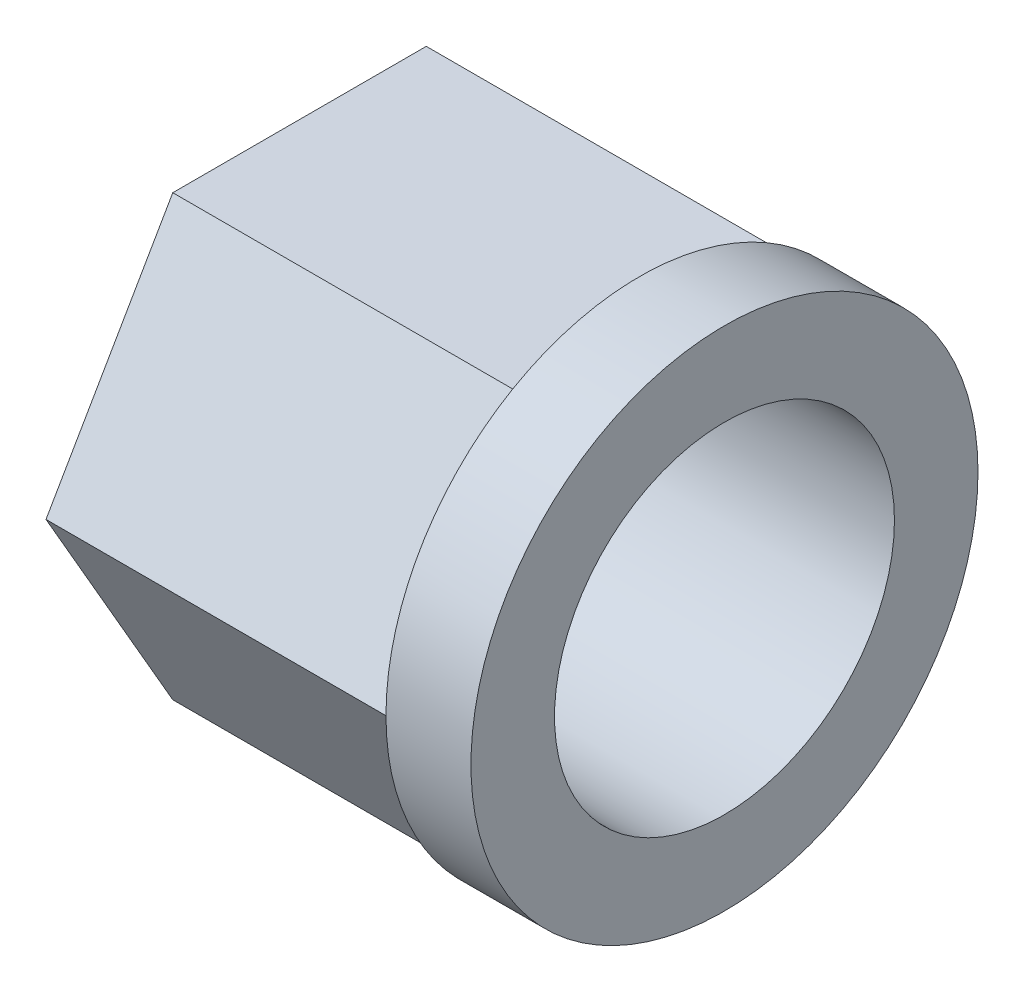
ISO-10303-21;
HEADER;
FILE_DESCRIPTION(('STEP AP214'),'2;1');
FILE_NAME('part.step','',(''),(''),'','','');
FILE_SCHEMA(('AUTOMOTIVE_DESIGN { 1 0 10303 214 1 1 1 1 }'));
ENDSEC;
DATA;
#1=APPLICATION_CONTEXT('core data for automotive mechanical design processes');
#2=APPLICATION_PROTOCOL_DEFINITION('international standard','automotive_design',2000,#1);
#3=PRODUCT_CONTEXT('',#1,'mechanical');
#4=PRODUCT('Part','Part','',(#3));
#5=PRODUCT_RELATED_PRODUCT_CATEGORY('part','',(#4));
#6=PRODUCT_DEFINITION_FORMATION('','',#4);
#7=PRODUCT_DEFINITION_CONTEXT('part definition',#1,'design');
#8=PRODUCT_DEFINITION('design','',#6,#7);
#9=PRODUCT_DEFINITION_SHAPE('','',#8);
#10=(LENGTH_UNIT() NAMED_UNIT(*) SI_UNIT(.MILLI.,.METRE.));
#11=(NAMED_UNIT(*) PLANE_ANGLE_UNIT() SI_UNIT($,.RADIAN.));
#12=(NAMED_UNIT(*) SI_UNIT($,.STERADIAN.) SOLID_ANGLE_UNIT());
#13=UNCERTAINTY_MEASURE_WITH_UNIT(LENGTH_MEASURE(1.E-05),#10,'distance_accuracy_value','');
#14=(GEOMETRIC_REPRESENTATION_CONTEXT(3) GLOBAL_UNCERTAINTY_ASSIGNED_CONTEXT((#13)) GLOBAL_UNIT_ASSIGNED_CONTEXT((#10,
#11,#12)) REPRESENTATION_CONTEXT('',''));
#15=CARTESIAN_POINT('',(0.,0.,0.));
#16=DIRECTION('',(0.,0.,1.));
#17=DIRECTION('',(1.,0.,0.));
#18=AXIS2_PLACEMENT_3D('',#15,#16,#17);
#19=CARTESIAN_POINT('',(-8.,0.,0.));
#20=DIRECTION('',(1.,0.,0.));
#21=DIRECTION('',(0.,0.,-1.));
#22=AXIS2_PLACEMENT_3D('',#19,#20,#21);
#23=CYLINDRICAL_SURFACE('',#22,3.175);
#24=CARTESIAN_POINT('',(0.,0.,0.));
#25=DIRECTION('',(1.,0.,0.));
#26=DIRECTION('',(0.,0.,-1.));
#27=AXIS2_PLACEMENT_3D('',#24,#25,#26);
#28=CIRCLE('',#27,3.175);
#29=CARTESIAN_POINT('',(0.,0.,-3.175));
#30=VERTEX_POINT('',#29);
#31=EDGE_CURVE('E175',#30,#30,#28,.T.);
#32=ORIENTED_EDGE('',*,*,#31,.F.);
#33=EDGE_LOOP('',(#32));
#34=FACE_BOUND('',#33,.T.);
#35=CARTESIAN_POINT('',(2.,0.,0.));
#36=DIRECTION('',(1.,0.,0.));
#37=DIRECTION('',(0.,0.,-1.));
#38=AXIS2_PLACEMENT_3D('',#35,#36,#37);
#39=CIRCLE('',#38,3.175);
#40=CARTESIAN_POINT('',(2.,0.,-3.175));
#41=VERTEX_POINT('',#40);
#42=EDGE_CURVE('E39',#41,#41,#39,.F.);
#43=ORIENTED_EDGE('',*,*,#42,.F.);
#44=EDGE_LOOP('',(#43));
#45=FACE_BOUND('',#44,.T.);
#46=ADVANCED_FACE('F35',(#34,#45),#23,.F.);
#47=CARTESIAN_POINT('',(12.,-7.75,-4.4744645862196));
#48=DIRECTION('',(0.,0.499999999999999,0.866025403784439));
#49=DIRECTION('',(0.,-0.866025403784439,0.499999999999999));
#50=AXIS2_PLACEMENT_3D('',#47,#48,#49);
#51=PLANE('',#50);
#52=DIRECTION('',(0.,0.866025403784439,-0.499999999999999));
#53=VECTOR('',#52,1.);
#54=CARTESIAN_POINT('',(0.,-7.75,-4.4744645862196));
#55=LINE('',#54,#53);
#56=CARTESIAN_POINT('',(0.,-7.75,-4.4744645862196));
#57=VERTEX_POINT('',#56);
#58=CARTESIAN_POINT('',(0.,0.,-8.9489291724392));
#59=VERTEX_POINT('',#58);
#60=EDGE_CURVE('E150',#57,#59,#55,.T.);
#61=ORIENTED_EDGE('',*,*,#60,.T.);
#62=DIRECTION('',(-1.,0.,0.));
#63=VECTOR('',#62,1.);
#64=CARTESIAN_POINT('',(12.,0.,-8.9489291724392));
#65=LINE('',#64,#63);
#66=CARTESIAN_POINT('',(12.,0.,-8.9489291724392));
#67=VERTEX_POINT('',#66);
#68=EDGE_CURVE('E11',#67,#59,#65,.T.);
#69=ORIENTED_EDGE('',*,*,#68,.F.);
#70=DIRECTION('',(0.,0.866025403784439,-0.499999999999999));
#71=VECTOR('',#70,1.);
#72=CARTESIAN_POINT('',(12.,-7.75,-4.4744645862196));
#73=LINE('',#72,#71);
#74=CARTESIAN_POINT('',(12.,-7.75,-4.4744645862196));
#75=VERTEX_POINT('',#74);
#76=EDGE_CURVE('E140',#75,#67,#73,.T.);
#77=ORIENTED_EDGE('',*,*,#76,.F.);
#78=DIRECTION('',(-1.,0.,0.));
#79=VECTOR('',#78,1.);
#80=CARTESIAN_POINT('',(12.,-7.75,-4.4744645862196));
#81=LINE('',#80,#79);
#82=EDGE_CURVE('E149',#75,#57,#81,.T.);
#83=ORIENTED_EDGE('',*,*,#82,.T.);
#84=EDGE_LOOP('',(#61,#69,#77,#83));
#85=FACE_BOUND('',#84,.T.);
#86=ADVANCED_FACE('F37',(#85),#51,.F.);
#87=CARTESIAN_POINT('',(12.,0.,-8.9489291724392));
#88=DIRECTION('',(0.,-0.5,0.866025403784439));
#89=DIRECTION('',(0.,-0.866025403784439,-0.5));
#90=AXIS2_PLACEMENT_3D('',#87,#88,#89);
#91=PLANE('',#90);
#92=DIRECTION('',(0.,0.866025403784439,0.5));
#93=VECTOR('',#92,1.);
#94=CARTESIAN_POINT('',(0.,0.,-8.9489291724392));
#95=LINE('',#94,#93);
#96=CARTESIAN_POINT('',(0.,7.75,-4.4744645862196));
#97=VERTEX_POINT('',#96);
#98=EDGE_CURVE('E153',#59,#97,#95,.T.);
#99=ORIENTED_EDGE('',*,*,#98,.T.);
#100=DIRECTION('',(-1.,0.,0.));
#101=VECTOR('',#100,1.);
#102=CARTESIAN_POINT('',(12.,7.75,-4.4744645862196));
#103=LINE('',#102,#101);
#104=CARTESIAN_POINT('',(12.,7.75,-4.4744645862196));
#105=VERTEX_POINT('',#104);
#106=EDGE_CURVE('E45',#105,#97,#103,.T.);
#107=ORIENTED_EDGE('',*,*,#106,.F.);
#108=DIRECTION('',(0.,0.866025403784439,0.5));
#109=VECTOR('',#108,1.);
#110=CARTESIAN_POINT('',(12.,0.,-8.9489291724392));
#111=LINE('',#110,#109);
#112=EDGE_CURVE('E89',#67,#105,#111,.T.);
#113=ORIENTED_EDGE('',*,*,#112,.F.);
#114=ORIENTED_EDGE('',*,*,#68,.T.);
#115=EDGE_LOOP('',(#99,#107,#113,#114));
#116=FACE_BOUND('',#115,.T.);
#117=ADVANCED_FACE('F217',(#116),#91,.F.);
#118=CARTESIAN_POINT('',(12.,7.75,-4.4744645862196));
#119=DIRECTION('',(0.,-1.,0.));
#120=DIRECTION('',(0.,0.,-1.));
#121=AXIS2_PLACEMENT_3D('',#118,#119,#120);
#122=PLANE('',#121);
#123=DIRECTION('',(0.,0.,1.));
#124=VECTOR('',#123,1.);
#125=CARTESIAN_POINT('',(0.,7.75,-4.4744645862196));
#126=LINE('',#125,#124);
#127=CARTESIAN_POINT('',(0.,7.75,4.4744645862196));
#128=VERTEX_POINT('',#127);
#129=EDGE_CURVE('E104',#97,#128,#126,.T.);
#130=ORIENTED_EDGE('',*,*,#129,.T.);
#131=DIRECTION('',(-1.,0.,0.));
#132=VECTOR('',#131,1.);
#133=CARTESIAN_POINT('',(12.,7.75,4.4744645862196));
#134=LINE('',#133,#132);
#135=CARTESIAN_POINT('',(12.,7.75,4.4744645862196));
#136=VERTEX_POINT('',#135);
#137=EDGE_CURVE('E97',#136,#128,#134,.T.);
#138=ORIENTED_EDGE('',*,*,#137,.F.);
#139=DIRECTION('',(0.,0.,1.));
#140=VECTOR('',#139,1.);
#141=CARTESIAN_POINT('',(12.,7.75,-4.4744645862196));
#142=LINE('',#141,#140);
#143=EDGE_CURVE('E102',#105,#136,#142,.T.);
#144=ORIENTED_EDGE('',*,*,#143,.F.);
#145=ORIENTED_EDGE('',*,*,#106,.T.);
#146=EDGE_LOOP('',(#130,#138,#144,#145));
#147=FACE_BOUND('',#146,.T.);
#148=ADVANCED_FACE('F99',(#147),#122,.F.);
#149=CARTESIAN_POINT('',(12.,7.75,4.4744645862196));
#150=DIRECTION('',(0.,-0.5,-0.866025403784439));
#151=DIRECTION('',(0.,0.866025403784439,-0.5));
#152=AXIS2_PLACEMENT_3D('',#149,#150,#151);
#153=PLANE('',#152);
#154=DIRECTION('',(0.,-0.866025403784439,0.5));
#155=VECTOR('',#154,1.);
#156=CARTESIAN_POINT('',(0.,7.75,4.4744645862196));
#157=LINE('',#156,#155);
#158=CARTESIAN_POINT('',(0.,0.,8.9489291724392));
#159=VERTEX_POINT('',#158);
#160=EDGE_CURVE('E156',#128,#159,#157,.T.);
#161=ORIENTED_EDGE('',*,*,#160,.T.);
#162=DIRECTION('',(-1.,0.,0.));
#163=VECTOR('',#162,1.);
#164=CARTESIAN_POINT('',(12.,0.,8.9489291724392));
#165=LINE('',#164,#163);
#166=CARTESIAN_POINT('',(12.,0.,8.9489291724392));
#167=VERTEX_POINT('',#166);
#168=EDGE_CURVE('E107',#167,#159,#165,.T.);
#169=ORIENTED_EDGE('',*,*,#168,.F.);
#170=DIRECTION('',(0.,-0.866025403784439,0.5));
#171=VECTOR('',#170,1.);
#172=CARTESIAN_POINT('',(12.,7.75,4.4744645862196));
#173=LINE('',#172,#171);
#174=EDGE_CURVE('E110',#136,#167,#173,.T.);
#175=ORIENTED_EDGE('',*,*,#174,.F.);
#176=ORIENTED_EDGE('',*,*,#137,.T.);
#177=EDGE_LOOP('',(#161,#169,#175,#176));
#178=FACE_BOUND('',#177,.T.);
#179=ADVANCED_FACE('F111',(#178),#153,.F.);
#180=CARTESIAN_POINT('',(12.,0.,8.9489291724392));
#181=DIRECTION('',(0.,0.5,-0.866025403784439));
#182=DIRECTION('',(0.,0.866025403784439,0.5));
#183=AXIS2_PLACEMENT_3D('',#180,#181,#182);
#184=PLANE('',#183);
#185=DIRECTION('',(0.,-0.866025403784438,-0.5));
#186=VECTOR('',#185,1.);
#187=CARTESIAN_POINT('',(0.,0.,8.9489291724392));
#188=LINE('',#187,#186);
#189=CARTESIAN_POINT('',(0.,-7.75,4.4744645862196));
#190=VERTEX_POINT('',#189);
#191=EDGE_CURVE('E75',#159,#190,#188,.T.);
#192=ORIENTED_EDGE('',*,*,#191,.T.);
#193=DIRECTION('',(-1.,0.,0.));
#194=VECTOR('',#193,1.);
#195=CARTESIAN_POINT('',(12.,-7.75,4.4744645862196));
#196=LINE('',#195,#194);
#197=CARTESIAN_POINT('',(12.,-7.75,4.4744645862196));
#198=VERTEX_POINT('',#197);
#199=EDGE_CURVE('E53',#198,#190,#196,.T.);
#200=ORIENTED_EDGE('',*,*,#199,.F.);
#201=DIRECTION('',(0.,-0.866025403784438,-0.5));
#202=VECTOR('',#201,1.);
#203=CARTESIAN_POINT('',(12.,0.,8.9489291724392));
#204=LINE('',#203,#202);
#205=EDGE_CURVE('E115',#167,#198,#204,.T.);
#206=ORIENTED_EDGE('',*,*,#205,.F.);
#207=ORIENTED_EDGE('',*,*,#168,.T.);
#208=EDGE_LOOP('',(#192,#200,#206,#207));
#209=FACE_BOUND('',#208,.T.);
#210=ADVANCED_FACE('F166',(#209),#184,.F.);
#211=CARTESIAN_POINT('',(12.,-7.75,4.4744645862196));
#212=DIRECTION('',(0.,1.,0.));
#213=DIRECTION('',(0.,0.,1.));
#214=AXIS2_PLACEMENT_3D('',#211,#212,#213);
#215=PLANE('',#214);
#216=DIRECTION('',(0.,0.,-1.));
#217=VECTOR('',#216,1.);
#218=CARTESIAN_POINT('',(0.,-7.75,4.4744645862196));
#219=LINE('',#218,#217);
#220=EDGE_CURVE('E81',#190,#57,#219,.T.);
#221=ORIENTED_EDGE('',*,*,#220,.T.);
#222=ORIENTED_EDGE('',*,*,#82,.F.);
#223=DIRECTION('',(0.,0.,-1.));
#224=VECTOR('',#223,1.);
#225=CARTESIAN_POINT('',(12.,-7.75,4.4744645862196));
#226=LINE('',#225,#224);
#227=EDGE_CURVE('E146',#198,#75,#226,.T.);
#228=ORIENTED_EDGE('',*,*,#227,.F.);
#229=ORIENTED_EDGE('',*,*,#199,.T.);
#230=EDGE_LOOP('',(#221,#222,#228,#229));
#231=FACE_BOUND('',#230,.T.);
#232=ADVANCED_FACE('F234',(#231),#215,.F.);
#233=CARTESIAN_POINT('',(0.,0.,0.));
#234=DIRECTION('',(1.,0.,0.));
#235=DIRECTION('',(0.,0.,-1.));
#236=AXIS2_PLACEMENT_3D('',#233,#234,#235);
#237=PLANE('',#236);
#238=ORIENTED_EDGE('',*,*,#31,.T.);
#239=EDGE_LOOP('',(#238));
#240=FACE_BOUND('',#239,.T.);
#241=ORIENTED_EDGE('',*,*,#60,.F.);
#242=ORIENTED_EDGE('',*,*,#220,.F.);
#243=ORIENTED_EDGE('',*,*,#191,.F.);
#244=ORIENTED_EDGE('',*,*,#160,.F.);
#245=ORIENTED_EDGE('',*,*,#129,.F.);
#246=ORIENTED_EDGE('',*,*,#98,.F.);
#247=EDGE_LOOP('',(#241,#242,#243,#244,#245,#246));
#248=FACE_BOUND('',#247,.T.);
#249=ADVANCED_FACE('F165',(#240,#248),#237,.F.);
#250=CARTESIAN_POINT('',(12.,0.,0.));
#251=DIRECTION('',(1.,0.,0.));
#252=DIRECTION('',(0.,0.,-1.));
#253=AXIS2_PLACEMENT_3D('',#250,#251,#252);
#254=PLANE('',#253);
#255=CARTESIAN_POINT('',(12.,0.,0.));
#256=DIRECTION('',(1.,0.,0.));
#257=DIRECTION('',(0.,0.,-1.));
#258=AXIS2_PLACEMENT_3D('',#255,#256,#257);
#259=CIRCLE('',#258,8.9489291724392);
#260=EDGE_CURVE('E136',#75,#67,#259,.T.);
#261=ORIENTED_EDGE('',*,*,#260,.F.);
#262=ORIENTED_EDGE('',*,*,#76,.T.);
#263=EDGE_LOOP('',(#261,#262));
#264=FACE_BOUND('',#263,.T.);
#265=ADVANCED_FACE('F222',(#264),#254,.F.);
#266=EDGE_CURVE('E134',#67,#105,#259,.T.);
#267=ORIENTED_EDGE('',*,*,#266,.F.);
#268=ORIENTED_EDGE('',*,*,#112,.T.);
#269=EDGE_LOOP('',(#267,#268));
#270=FACE_BOUND('',#269,.T.);
#271=ADVANCED_FACE('F227',(#270),#254,.F.);
#272=EDGE_CURVE('E121',#105,#136,#259,.T.);
#273=ORIENTED_EDGE('',*,*,#272,.F.);
#274=ORIENTED_EDGE('',*,*,#143,.T.);
#275=EDGE_LOOP('',(#273,#274));
#276=FACE_BOUND('',#275,.T.);
#277=ADVANCED_FACE('F119',(#276),#254,.F.);
#278=EDGE_CURVE('E125',#136,#167,#259,.T.);
#279=ORIENTED_EDGE('',*,*,#278,.F.);
#280=ORIENTED_EDGE('',*,*,#174,.T.);
#281=EDGE_LOOP('',(#279,#280));
#282=FACE_BOUND('',#281,.T.);
#283=ADVANCED_FACE('F126',(#282),#254,.F.);
#284=EDGE_CURVE('E129',#167,#198,#259,.T.);
#285=ORIENTED_EDGE('',*,*,#284,.F.);
#286=ORIENTED_EDGE('',*,*,#205,.T.);
#287=EDGE_LOOP('',(#285,#286));
#288=FACE_BOUND('',#287,.T.);
#289=ADVANCED_FACE('F169',(#288),#254,.F.);
#290=CARTESIAN_POINT('',(15.,0.,0.));
#291=DIRECTION('',(-1.,0.,0.));
#292=DIRECTION('',(0.,0.,1.));
#293=AXIS2_PLACEMENT_3D('',#290,#291,#292);
#294=CYLINDRICAL_SURFACE('',#293,8.9489291724392);
#295=CARTESIAN_POINT('',(15.,0.,0.));
#296=DIRECTION('',(1.,0.,0.));
#297=DIRECTION('',(0.,0.,-1.));
#298=AXIS2_PLACEMENT_3D('',#295,#296,#297);
#299=CIRCLE('',#298,8.9489291724392);
#300=CARTESIAN_POINT('',(15.,0.,-8.9489291724392));
#301=VERTEX_POINT('',#300);
#302=EDGE_CURVE('E135',#301,#301,#299,.T.);
#303=ORIENTED_EDGE('',*,*,#302,.F.);
#304=EDGE_LOOP('',(#303));
#305=FACE_BOUND('',#304,.T.);
#306=ORIENTED_EDGE('',*,*,#266,.T.);
#307=ORIENTED_EDGE('',*,*,#272,.T.);
#308=ORIENTED_EDGE('',*,*,#278,.T.);
#309=ORIENTED_EDGE('',*,*,#284,.T.);
#310=EDGE_CURVE('E172',#198,#75,#259,.T.);
#311=ORIENTED_EDGE('',*,*,#310,.T.);
#312=ORIENTED_EDGE('',*,*,#260,.T.);
#313=EDGE_LOOP('',(#306,#307,#308,#309,#311,#312));
#314=FACE_BOUND('',#313,.T.);
#315=ADVANCED_FACE('F131',(#305,#314),#294,.T.);
#316=CARTESIAN_POINT('',(15.,0.,0.));
#317=DIRECTION('',(1.,0.,0.));
#318=DIRECTION('',(0.,0.,-1.));
#319=AXIS2_PLACEMENT_3D('',#316,#317,#318);
#320=PLANE('',#319);
#321=CARTESIAN_POINT('',(15.,0.,0.));
#322=DIRECTION('',(1.,0.,0.));
#323=DIRECTION('',(0.,0.,-1.));
#324=AXIS2_PLACEMENT_3D('',#321,#322,#323);
#325=CIRCLE('',#324,6.);
#326=CARTESIAN_POINT('',(15.,0.,-6.));
#327=VERTEX_POINT('',#326);
#328=EDGE_CURVE('E182',#327,#327,#325,.T.);
#329=ORIENTED_EDGE('',*,*,#328,.F.);
#330=EDGE_LOOP('',(#329));
#331=FACE_BOUND('',#330,.T.);
#332=ORIENTED_EDGE('',*,*,#302,.T.);
#333=EDGE_LOOP('',(#332));
#334=FACE_BOUND('',#333,.T.);
#335=ADVANCED_FACE('F197',(#331,#334),#320,.T.);
#336=ORIENTED_EDGE('',*,*,#310,.F.);
#337=ORIENTED_EDGE('',*,*,#227,.T.);
#338=EDGE_LOOP('',(#336,#337));
#339=FACE_BOUND('',#338,.T.);
#340=ADVANCED_FACE('F173',(#339),#254,.F.);
#341=CARTESIAN_POINT('',(2.,0.,0.));
#342=DIRECTION('',(1.,0.,0.));
#343=DIRECTION('',(0.,0.,-1.));
#344=AXIS2_PLACEMENT_3D('',#341,#342,#343);
#345=PLANE('',#344);
#346=CARTESIAN_POINT('',(2.,0.,0.));
#347=DIRECTION('',(1.,0.,0.));
#348=DIRECTION('',(0.,0.,-1.));
#349=AXIS2_PLACEMENT_3D('',#346,#347,#348);
#350=CIRCLE('',#349,6.);
#351=CARTESIAN_POINT('',(2.,0.,-6.));
#352=VERTEX_POINT('',#351);
#353=EDGE_CURVE('E180',#352,#352,#350,.T.);
#354=ORIENTED_EDGE('',*,*,#353,.T.);
#355=EDGE_LOOP('',(#354));
#356=FACE_BOUND('',#355,.T.);
#357=ORIENTED_EDGE('',*,*,#42,.T.);
#358=EDGE_LOOP('',(#357));
#359=FACE_BOUND('',#358,.T.);
#360=ADVANCED_FACE('F188',(#356,#359),#345,.T.);
#361=CARTESIAN_POINT('',(2.,0.,0.));
#362=DIRECTION('',(1.,0.,0.));
#363=DIRECTION('',(0.,0.,-1.));
#364=AXIS2_PLACEMENT_3D('',#361,#362,#363);
#365=CYLINDRICAL_SURFACE('',#364,6.);
#366=CARTESIAN_POINT('',(2.,0.,-6.));
#367=CARTESIAN_POINT('',(2.13541666666667,0.,-6.));
#368=CARTESIAN_POINT('',(2.27083333333333,0.,-6.));
#369=CARTESIAN_POINT('',(2.54166666666667,0.,-6.));
#370=CARTESIAN_POINT('',(2.67708333333333,0.,-6.));
#371=CARTESIAN_POINT('',(2.94791666666667,0.,-6.));
#372=CARTESIAN_POINT('',(3.08333333333333,0.,-6.));
#373=CARTESIAN_POINT('',(3.35416666666667,0.,-6.));
#374=CARTESIAN_POINT('',(3.48958333333333,0.,-6.));
#375=CARTESIAN_POINT('',(3.76041666666667,0.,-6.));
#376=CARTESIAN_POINT('',(3.89583333333333,0.,-6.));
#377=CARTESIAN_POINT('',(4.16666666666667,0.,-6.));
#378=CARTESIAN_POINT('',(4.30208333333333,0.,-6.));
#379=CARTESIAN_POINT('',(4.57291666666667,0.,-6.));
#380=CARTESIAN_POINT('',(4.70833333333333,0.,-6.));
#381=CARTESIAN_POINT('',(4.97916666666667,0.,-6.));
#382=CARTESIAN_POINT('',(5.11458333333333,0.,-6.));
#383=CARTESIAN_POINT('',(5.38541666666667,0.,-6.));
#384=CARTESIAN_POINT('',(5.52083333333333,0.,-6.));
#385=CARTESIAN_POINT('',(5.79166666666667,0.,-6.));
#386=CARTESIAN_POINT('',(5.92708333333333,0.,-6.));
#387=CARTESIAN_POINT('',(6.19791666666667,0.,-6.));
#388=CARTESIAN_POINT('',(6.33333333333333,0.,-6.));
#389=CARTESIAN_POINT('',(6.60416666666667,0.,-6.));
#390=CARTESIAN_POINT('',(6.73958333333333,0.,-6.));
#391=CARTESIAN_POINT('',(7.01041666666667,0.,-6.));
#392=CARTESIAN_POINT('',(7.14583333333333,0.,-6.));
#393=CARTESIAN_POINT('',(7.41666666666667,0.,-6.));
#394=CARTESIAN_POINT('',(7.55208333333333,0.,-6.));
#395=CARTESIAN_POINT('',(7.82291666666667,0.,-6.));
#396=CARTESIAN_POINT('',(7.95833333333333,0.,-6.));
#397=CARTESIAN_POINT('',(8.22916666666667,0.,-6.));
#398=CARTESIAN_POINT('',(8.36458333333333,0.,-6.));
#399=CARTESIAN_POINT('',(8.63541666666667,0.,-6.));
#400=CARTESIAN_POINT('',(8.77083333333333,0.,-6.));
#401=CARTESIAN_POINT('',(9.04166666666667,0.,-6.));
#402=CARTESIAN_POINT('',(9.17708333333333,0.,-6.));
#403=CARTESIAN_POINT('',(9.44791666666667,0.,-6.));
#404=CARTESIAN_POINT('',(9.58333333333333,0.,-6.));
#405=CARTESIAN_POINT('',(9.85416666666667,0.,-6.));
#406=CARTESIAN_POINT('',(9.98958333333333,0.,-6.));
#407=CARTESIAN_POINT('',(10.2604166666667,0.,-6.));
#408=CARTESIAN_POINT('',(10.3958333333333,0.,-6.));
#409=CARTESIAN_POINT('',(10.6666666666667,0.,-6.));
#410=CARTESIAN_POINT('',(10.8020833333333,0.,-6.));
#411=CARTESIAN_POINT('',(11.0729166666667,0.,-6.));
#412=CARTESIAN_POINT('',(11.2083333333333,0.,-6.));
#413=CARTESIAN_POINT('',(11.4791666666667,0.,-6.));
#414=CARTESIAN_POINT('',(11.6145833333333,0.,-6.));
#415=CARTESIAN_POINT('',(11.8854166666667,0.,-6.));
#416=CARTESIAN_POINT('',(12.0208333333333,0.,-6.));
#417=CARTESIAN_POINT('',(12.2916666666667,0.,-6.));
#418=CARTESIAN_POINT('',(12.4270833333333,0.,-6.));
#419=CARTESIAN_POINT('',(12.6979166666667,0.,-6.));
#420=CARTESIAN_POINT('',(12.8333333333333,0.,-6.));
#421=CARTESIAN_POINT('',(13.1041666666667,0.,-6.));
#422=CARTESIAN_POINT('',(13.2395833333333,0.,-6.));
#423=CARTESIAN_POINT('',(13.5104166666667,0.,-6.));
#424=CARTESIAN_POINT('',(13.6458333333333,0.,-6.));
#425=CARTESIAN_POINT('',(13.9166666666667,0.,-6.));
#426=CARTESIAN_POINT('',(14.0520833333333,0.,-6.));
#427=CARTESIAN_POINT('',(14.3229166666667,0.,-6.));
#428=CARTESIAN_POINT('',(14.4583333333333,0.,-6.));
#429=CARTESIAN_POINT('',(14.7291666666667,0.,-6.));
#430=CARTESIAN_POINT('',(14.8645833333333,0.,-6.));
#431=CARTESIAN_POINT('',(15.,0.,-6.));
#432=B_SPLINE_CURVE_WITH_KNOTS('',3,(#366,#367,#368,#369,#370,#371,#372,#373,#374,#375,#376,
#377,#378,#379,#380,#381,#382,#383,#384,#385,#386,#387,#388,#389,#390,#391,#392,#393,#394,#395,
#396,#397,#398,#399,#400,#401,#402,#403,#404,#405,#406,#407,#408,#409,#410,#411,#412,#413,#414,
#415,#416,#417,#418,#419,#420,#421,#422,#423,#424,#425,#426,#427,#428,#429,#430,#431),
.UNSPECIFIED.,.F.,.F.,(4,2,2,2,2,2,2,2,2,2,2,2,2,2,2,2,2,2,2,2,2,2,2,2,2,2,2,2,2,2,2,2,4),(0.,
0.40625,0.8125,1.21875,1.625,2.03125,2.4375,2.84375,3.25,3.65625,4.0625,4.46875,4.875,5.28125,
5.6875,6.09375,6.5,6.90625,7.3125,7.71875,8.125,8.53125,8.9375,9.34375,9.75,10.15625,10.5625,
10.96875,11.375,11.78125,12.1875,12.59375,13.),.UNSPECIFIED.);
#433=EDGE_CURVE('BSEAM191',#352,#327,#432,.T.);
#434=ORIENTED_EDGE('',*,*,#353,.F.);
#435=ORIENTED_EDGE('',*,*,#328,.T.);
#436=ORIENTED_EDGE('',*,*,#433,.T.);
#437=ORIENTED_EDGE('',*,*,#433,.F.);
#438=EDGE_LOOP('',(#434,#436,#435,#437));
#439=FACE_BOUND('',#438,.T.);
#440=ADVANCED_FACE('F191',(#439),#365,.F.);
#441=CLOSED_SHELL('',(#46,#86,#117,#148,#179,#210,#232,#249,#265,#271,#277,#283,#289,#315,#335,
#340,#360,#440));
#442=MANIFOLD_SOLID_BREP('B2',#441);
#443=ADVANCED_BREP_SHAPE_REPRESENTATION('',(#18,#442),#14);
#444=SHAPE_DEFINITION_REPRESENTATION(#9,#443);
ENDSEC;
END-ISO-10303-21;
